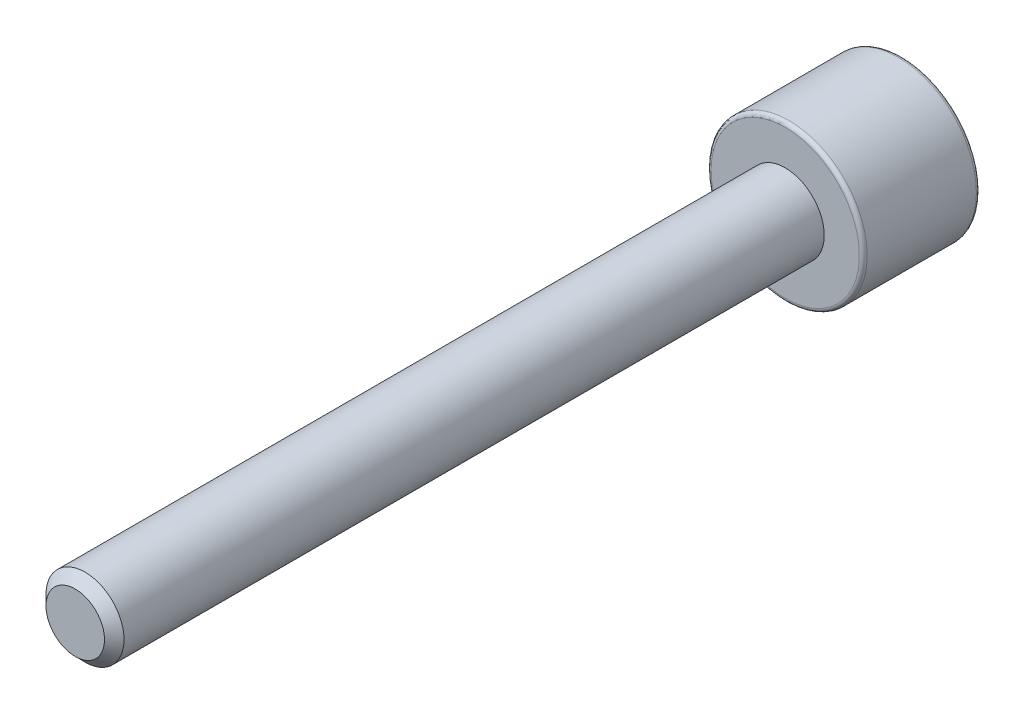
ISO-10303-21;
HEADER;
FILE_DESCRIPTION(('STEP AP214'),'2;1');
FILE_NAME('part.step','',(''),(''),'','','');
FILE_SCHEMA(('AUTOMOTIVE_DESIGN { 1 0 10303 214 1 1 1 1 }'));
ENDSEC;
DATA;
#1=APPLICATION_CONTEXT('core data for automotive mechanical design processes');
#2=APPLICATION_PROTOCOL_DEFINITION('international standard','automotive_design',2000,#1);
#3=PRODUCT_CONTEXT('',#1,'mechanical');
#4=PRODUCT('Part','Part','',(#3));
#5=PRODUCT_RELATED_PRODUCT_CATEGORY('part','',(#4));
#6=PRODUCT_DEFINITION_FORMATION('','',#4);
#7=PRODUCT_DEFINITION_CONTEXT('part definition',#1,'design');
#8=PRODUCT_DEFINITION('design','',#6,#7);
#9=PRODUCT_DEFINITION_SHAPE('','',#8);
#10=(LENGTH_UNIT() NAMED_UNIT(*) SI_UNIT(.MILLI.,.METRE.));
#11=(NAMED_UNIT(*) PLANE_ANGLE_UNIT() SI_UNIT($,.RADIAN.));
#12=(NAMED_UNIT(*) SI_UNIT($,.STERADIAN.) SOLID_ANGLE_UNIT());
#13=UNCERTAINTY_MEASURE_WITH_UNIT(LENGTH_MEASURE(1.E-05),#10,'distance_accuracy_value','');
#14=(GEOMETRIC_REPRESENTATION_CONTEXT(3) GLOBAL_UNCERTAINTY_ASSIGNED_CONTEXT((#13)) GLOBAL_UNIT_ASSIGNED_CONTEXT((#10,
#11,#12)) REPRESENTATION_CONTEXT('',''));
#15=CARTESIAN_POINT('',(0.,0.,0.));
#16=DIRECTION('',(0.,0.,1.));
#17=DIRECTION('',(1.,0.,0.));
#18=AXIS2_PLACEMENT_3D('',#15,#16,#17);
#19=CARTESIAN_POINT('',(0.,4.00000000000001,-6.));
#20=DIRECTION('',(0.,0.,1.));
#21=DIRECTION('',(1.,0.,0.));
#22=AXIS2_PLACEMENT_3D('',#19,#20,#21);
#23=PLANE('',#22);
#24=CARTESIAN_POINT('',(2.39807621135331,-1.38452994616208,-6.));
#25=DIRECTION('',(0.,0.,1.));
#26=DIRECTION('',(1.,0.,0.));
#27=AXIS2_PLACEMENT_3D('',#24,#25,#26);
#28=CIRCLE('',#27,0.4);
#29=CARTESIAN_POINT('',(2.79807621135332,-1.38452994616208,-6.));
#30=VERTEX_POINT('',#29);
#31=CARTESIAN_POINT('',(2.59807621135331,-1.73094010767585,-6.));
#32=VERTEX_POINT('',#31);
#33=EDGE_CURVE('E65',#30,#32,#28,.F.);
#34=ORIENTED_EDGE('',*,*,#33,.F.);
#35=DIRECTION('',(0.,-1.,0.));
#36=VECTOR('',#35,1.);
#37=CARTESIAN_POINT('',(2.79807621135332,1.5,-6.));
#38=LINE('',#37,#36);
#39=CARTESIAN_POINT('',(2.79807621135332,1.38452994616208,-6.));
#40=VERTEX_POINT('',#39);
#41=EDGE_CURVE('E11',#30,#40,#38,.F.);
#42=ORIENTED_EDGE('',*,*,#41,.T.);
#43=CARTESIAN_POINT('',(2.39807621135332,1.38452994616208,-6.));
#44=DIRECTION('',(0.,0.,1.));
#45=DIRECTION('',(1.,0.,0.));
#46=AXIS2_PLACEMENT_3D('',#43,#44,#45);
#47=CIRCLE('',#46,0.4);
#48=CARTESIAN_POINT('',(2.59807621135332,1.73094010767585,-6.));
#49=VERTEX_POINT('',#48);
#50=EDGE_CURVE('E55',#49,#40,#47,.F.);
#51=ORIENTED_EDGE('',*,*,#50,.F.);
#52=DIRECTION('',(0.866025403784439,-0.5,0.));
#53=VECTOR('',#52,1.);
#54=CARTESIAN_POINT('',(0.1,3.17320508075689,-6.));
#55=LINE('',#54,#53);
#56=CARTESIAN_POINT('',(0.2,3.11547005383793,-6.));
#57=VERTEX_POINT('',#56);
#58=EDGE_CURVE('E307',#49,#57,#55,.F.);
#59=ORIENTED_EDGE('',*,*,#58,.T.);
#60=CARTESIAN_POINT('',(0.,2.76905989232415,-6.));
#61=DIRECTION('',(0.,0.,1.));
#62=DIRECTION('',(1.,0.,0.));
#63=AXIS2_PLACEMENT_3D('',#60,#61,#62);
#64=CIRCLE('',#63,0.4);
#65=CARTESIAN_POINT('',(-0.2,3.11547005383792,-6.));
#66=VERTEX_POINT('',#65);
#67=EDGE_CURVE('E303',#66,#57,#64,.F.);
#68=ORIENTED_EDGE('',*,*,#67,.F.);
#69=DIRECTION('',(0.866025403784439,0.5,0.));
#70=VECTOR('',#69,1.);
#71=CARTESIAN_POINT('',(-2.69807621135332,1.67320508075689,-6.));
#72=LINE('',#71,#70);
#73=CARTESIAN_POINT('',(-2.59807621135332,1.73094010767585,-6.));
#74=VERTEX_POINT('',#73);
#75=EDGE_CURVE('E302',#66,#74,#72,.F.);
#76=ORIENTED_EDGE('',*,*,#75,.T.);
#77=CARTESIAN_POINT('',(-2.39807621135332,1.38452994616208,-6.));
#78=DIRECTION('',(0.,0.,1.));
#79=DIRECTION('',(1.,0.,0.));
#80=AXIS2_PLACEMENT_3D('',#77,#78,#79);
#81=CIRCLE('',#80,0.4);
#82=CARTESIAN_POINT('',(-2.79807621135332,1.38452994616208,-6.));
#83=VERTEX_POINT('',#82);
#84=EDGE_CURVE('E214',#83,#74,#81,.F.);
#85=ORIENTED_EDGE('',*,*,#84,.F.);
#86=DIRECTION('',(0.,1.,0.));
#87=VECTOR('',#86,1.);
#88=CARTESIAN_POINT('',(-2.79807621135332,-1.5,-6.));
#89=LINE('',#88,#87);
#90=CARTESIAN_POINT('',(-2.79807621135332,-1.38452994616207,-6.));
#91=VERTEX_POINT('',#90);
#92=EDGE_CURVE('E300',#83,#91,#89,.F.);
#93=ORIENTED_EDGE('',*,*,#92,.T.);
#94=CARTESIAN_POINT('',(-2.39807621135332,-1.38452994616207,-6.));
#95=DIRECTION('',(0.,0.,1.));
#96=DIRECTION('',(1.,0.,0.));
#97=AXIS2_PLACEMENT_3D('',#94,#95,#96);
#98=CIRCLE('',#97,0.4);
#99=CARTESIAN_POINT('',(-2.59807621135332,-1.73094010767585,-6.));
#100=VERTEX_POINT('',#99);
#101=EDGE_CURVE('E293',#100,#91,#98,.F.);
#102=ORIENTED_EDGE('',*,*,#101,.F.);
#103=DIRECTION('',(-0.866025403784439,0.5,0.));
#104=VECTOR('',#103,1.);
#105=CARTESIAN_POINT('',(-0.0999999999999995,-3.17320508075689,-6.));
#106=LINE('',#105,#104);
#107=CARTESIAN_POINT('',(-0.2,-3.11547005383792,-6.));
#108=VERTEX_POINT('',#107);
#109=EDGE_CURVE('E291',#100,#108,#106,.F.);
#110=ORIENTED_EDGE('',*,*,#109,.T.);
#111=CARTESIAN_POINT('',(0.,-2.76905989232415,-6.));
#112=DIRECTION('',(0.,0.,1.));
#113=DIRECTION('',(1.,0.,0.));
#114=AXIS2_PLACEMENT_3D('',#111,#112,#113);
#115=CIRCLE('',#114,0.4);
#116=CARTESIAN_POINT('',(0.2,-3.11547005383792,-6.));
#117=VERTEX_POINT('',#116);
#118=EDGE_CURVE('E288',#117,#108,#115,.F.);
#119=ORIENTED_EDGE('',*,*,#118,.F.);
#120=DIRECTION('',(-0.866025403784439,-0.5,0.));
#121=VECTOR('',#120,1.);
#122=CARTESIAN_POINT('',(2.69807621135332,-1.67320508075689,-6.));
#123=LINE('',#122,#121);
#124=EDGE_CURVE('E305',#117,#32,#123,.F.);
#125=ORIENTED_EDGE('',*,*,#124,.T.);
#126=EDGE_LOOP('',(#34,#42,#51,#59,#68,#76,#85,#93,#102,#110,#119,#125));
#127=FACE_BOUND('',#126,.T.);
#128=CARTESIAN_POINT('',(0.,0.,-6.));
#129=DIRECTION('',(0.,0.,1.));
#130=DIRECTION('',(1.,0.,0.));
#131=AXIS2_PLACEMENT_3D('',#128,#129,#130);
#132=CIRCLE('',#131,3.8);
#133=CARTESIAN_POINT('',(3.8,0.,-6.));
#134=VERTEX_POINT('',#133);
#135=EDGE_CURVE('E230',#134,#134,#132,.F.);
#136=ORIENTED_EDGE('',*,*,#135,.T.);
#137=EDGE_LOOP('',(#136));
#138=FACE_BOUND('',#137,.T.);
#139=ADVANCED_FACE('F43',(#127,#138),#23,.F.);
#140=CARTESIAN_POINT('',(0.,0.,36.4));
#141=DIRECTION('',(0.,0.,-1.));
#142=DIRECTION('',(-1.,0.,0.));
#143=AXIS2_PLACEMENT_3D('',#140,#141,#142);
#144=PLANE('',#143);
#145=CARTESIAN_POINT('',(0.,0.,36.4));
#146=DIRECTION('',(0.,0.,-1.));
#147=DIRECTION('',(-1.,0.,0.));
#148=AXIS2_PLACEMENT_3D('',#145,#146,#147);
#149=CIRCLE('',#148,1.49999999999999);
#150=CARTESIAN_POINT('',(-1.49999999999999,0.,36.4));
#151=VERTEX_POINT('',#150);
#152=EDGE_CURVE('E409',#151,#151,#149,.F.);
#153=ORIENTED_EDGE('',*,*,#152,.T.);
#154=EDGE_LOOP('',(#153));
#155=FACE_BOUND('',#154,.T.);
#156=ADVANCED_FACE('F451',(#155),#144,.F.);
#157=CARTESIAN_POINT('',(0.,0.,38.5484021491711));
#158=DIRECTION('',(0.,0.,1.));
#159=DIRECTION('',(1.,0.,0.));
#160=AXIS2_PLACEMENT_3D('',#157,#158,#159);
#161=CYLINDRICAL_SURFACE('',#160,2.);
#162=CARTESIAN_POINT('',(0.,0.,35.9));
#163=DIRECTION('',(0.,0.,-1.));
#164=DIRECTION('',(-1.,0.,0.));
#165=AXIS2_PLACEMENT_3D('',#162,#163,#164);
#166=CIRCLE('',#165,2.);
#167=CARTESIAN_POINT('',(-2.,0.,35.9));
#168=VERTEX_POINT('',#167);
#169=EDGE_CURVE('E414',#168,#168,#166,.T.);
#170=ORIENTED_EDGE('',*,*,#169,.T.);
#171=EDGE_LOOP('',(#170));
#172=FACE_BOUND('',#171,.T.);
#173=CARTESIAN_POINT('',(0.,0.,0.));
#174=DIRECTION('',(0.,0.,1.));
#175=DIRECTION('',(1.,0.,0.));
#176=AXIS2_PLACEMENT_3D('',#173,#174,#175);
#177=CIRCLE('',#176,2.);
#178=CARTESIAN_POINT('',(2.,0.,0.));
#179=VERTEX_POINT('',#178);
#180=EDGE_CURVE('E402',#179,#179,#177,.T.);
#181=ORIENTED_EDGE('',*,*,#180,.T.);
#182=EDGE_LOOP('',(#181));
#183=FACE_BOUND('',#182,.T.);
#184=ADVANCED_FACE('F450',(#172,#183),#161,.T.);
#185=CARTESIAN_POINT('',(0.,2.,0.));
#186=DIRECTION('',(0.,0.,-1.));
#187=DIRECTION('',(-1.,0.,0.));
#188=AXIS2_PLACEMENT_3D('',#185,#186,#187);
#189=PLANE('',#188);
#190=CARTESIAN_POINT('',(0.,0.,0.));
#191=DIRECTION('',(0.,0.,-1.));
#192=DIRECTION('',(-1.,0.,0.));
#193=AXIS2_PLACEMENT_3D('',#190,#191,#192);
#194=CIRCLE('',#193,3.8);
#195=CARTESIAN_POINT('',(-3.8,0.,0.));
#196=VERTEX_POINT('',#195);
#197=EDGE_CURVE('E223',#196,#196,#194,.F.);
#198=ORIENTED_EDGE('',*,*,#197,.T.);
#199=EDGE_LOOP('',(#198));
#200=FACE_BOUND('',#199,.T.);
#201=ORIENTED_EDGE('',*,*,#180,.F.);
#202=EDGE_LOOP('',(#201));
#203=FACE_BOUND('',#202,.T.);
#204=ADVANCED_FACE('F440',(#200,#203),#189,.F.);
#205=CARTESIAN_POINT('',(0.,0.,38.5484021491711));
#206=DIRECTION('',(0.,0.,1.));
#207=DIRECTION('',(1.,0.,0.));
#208=AXIS2_PLACEMENT_3D('',#205,#206,#207);
#209=CYLINDRICAL_SURFACE('',#208,4.);
#210=CARTESIAN_POINT('',(0.,0.,-5.8));
#211=DIRECTION('',(0.,0.,1.));
#212=DIRECTION('',(1.,0.,0.));
#213=AXIS2_PLACEMENT_3D('',#210,#211,#212);
#214=CIRCLE('',#213,4.);
#215=CARTESIAN_POINT('',(4.,0.,-5.8));
#216=VERTEX_POINT('',#215);
#217=EDGE_CURVE('E419',#216,#216,#214,.T.);
#218=ORIENTED_EDGE('',*,*,#217,.T.);
#219=EDGE_LOOP('',(#218));
#220=FACE_BOUND('',#219,.T.);
#221=CARTESIAN_POINT('',(0.,0.,-0.199999999999999));
#222=DIRECTION('',(0.,0.,-1.));
#223=DIRECTION('',(-1.,0.,0.));
#224=AXIS2_PLACEMENT_3D('',#221,#222,#223);
#225=CIRCLE('',#224,4.);
#226=CARTESIAN_POINT('',(-4.,0.,-0.199999999999999));
#227=VERTEX_POINT('',#226);
#228=EDGE_CURVE('E417',#227,#227,#225,.T.);
#229=ORIENTED_EDGE('',*,*,#228,.T.);
#230=EDGE_LOOP('',(#229));
#231=FACE_BOUND('',#230,.T.);
#232=ADVANCED_FACE('F432',(#220,#231),#209,.T.);
#233=CARTESIAN_POINT('',(0.,0.,36.4));
#234=DIRECTION('',(0.,0.,-1.));
#235=DIRECTION('',(-1.,0.,0.));
#236=AXIS2_PLACEMENT_3D('',#233,#234,#235);
#237=CONICAL_SURFACE('',#236,1.49999999999999,0.785398163397449);
#238=ORIENTED_EDGE('',*,*,#169,.F.);
#239=EDGE_LOOP('',(#238));
#240=FACE_BOUND('',#239,.T.);
#241=ORIENTED_EDGE('',*,*,#152,.F.);
#242=EDGE_LOOP('',(#241));
#243=FACE_BOUND('',#242,.T.);
#244=ADVANCED_FACE('F429',(#240,#243),#237,.T.);
#245=CARTESIAN_POINT('',(0.,0.,-5.8));
#246=DIRECTION('',(0.,0.,1.));
#247=DIRECTION('',(1.,0.,0.));
#248=AXIS2_PLACEMENT_3D('',#245,#246,#247);
#249=TOROIDAL_SURFACE('',#248,3.8,0.2);
#250=ORIENTED_EDGE('',*,*,#135,.F.);
#251=EDGE_LOOP('',(#250));
#252=FACE_BOUND('',#251,.T.);
#253=ORIENTED_EDGE('',*,*,#217,.F.);
#254=EDGE_LOOP('',(#253));
#255=FACE_BOUND('',#254,.T.);
#256=ADVANCED_FACE('F426',(#252,#255),#249,.T.);
#257=CARTESIAN_POINT('',(0.,0.,-0.199999999999999));
#258=DIRECTION('',(0.,0.,-1.));
#259=DIRECTION('',(-1.,0.,0.));
#260=AXIS2_PLACEMENT_3D('',#257,#258,#259);
#261=TOROIDAL_SURFACE('',#260,3.8,0.2);
#262=ORIENTED_EDGE('',*,*,#228,.F.);
#263=EDGE_LOOP('',(#262));
#264=FACE_BOUND('',#263,.T.);
#265=ORIENTED_EDGE('',*,*,#197,.F.);
#266=EDGE_LOOP('',(#265));
#267=FACE_BOUND('',#266,.T.);
#268=ADVANCED_FACE('F427',(#264,#267),#261,.T.);
#269=CARTESIAN_POINT('',(-2.59807621135332,1.5,-6.000012));
#270=DIRECTION('',(0.5,-0.866025403784439,0.));
#271=DIRECTION('',(0.866025403784439,0.5,0.));
#272=AXIS2_PLACEMENT_3D('',#269,#270,#271);
#273=PLANE('',#272);
#274=DIRECTION('',(0.,0.,1.));
#275=VECTOR('',#274,1.);
#276=CARTESIAN_POINT('',(-0.1,2.94226497308104,-1.));
#277=LINE('',#276,#275);
#278=CARTESIAN_POINT('',(-0.1,2.94226497308104,-5.8));
#279=VERTEX_POINT('',#278);
#280=CARTESIAN_POINT('',(-0.1,2.94226497308104,-1.2));
#281=VERTEX_POINT('',#280);
#282=EDGE_CURVE('E198',#279,#281,#277,.T.);
#283=ORIENTED_EDGE('',*,*,#282,.T.);
#284=DIRECTION('',(0.866025403784439,0.5,0.));
#285=VECTOR('',#284,1.);
#286=CARTESIAN_POINT('',(-2.59807621135332,1.5,-1.2));
#287=LINE('',#286,#285);
#288=CARTESIAN_POINT('',(-2.49807621135332,1.55773502691896,-1.2));
#289=VERTEX_POINT('',#288);
#290=EDGE_CURVE('E194',#281,#289,#287,.F.);
#291=ORIENTED_EDGE('',*,*,#290,.T.);
#292=DIRECTION('',(0.,0.,1.));
#293=VECTOR('',#292,1.);
#294=CARTESIAN_POINT('',(-2.49807621135332,1.55773502691896,-6.));
#295=LINE('',#294,#293);
#296=CARTESIAN_POINT('',(-2.49807621135332,1.55773502691896,-5.8));
#297=VERTEX_POINT('',#296);
#298=EDGE_CURVE('E184',#289,#297,#295,.F.);
#299=ORIENTED_EDGE('',*,*,#298,.T.);
#300=DIRECTION('',(0.866025403784439,0.5,0.));
#301=VECTOR('',#300,1.);
#302=CARTESIAN_POINT('',(0.,3.,-5.8));
#303=LINE('',#302,#301);
#304=EDGE_CURVE('E186',#297,#279,#303,.T.);
#305=ORIENTED_EDGE('',*,*,#304,.T.);
#306=EDGE_LOOP('',(#283,#291,#299,#305));
#307=FACE_BOUND('',#306,.T.);
#308=ADVANCED_FACE('F189',(#307),#273,.T.);
#309=CARTESIAN_POINT('',(0.,3.,-6.000012));
#310=DIRECTION('',(-0.5,-0.866025403784439,0.));
#311=DIRECTION('',(0.866025403784439,-0.5,0.));
#312=AXIS2_PLACEMENT_3D('',#309,#310,#311);
#313=PLANE('',#312);
#314=DIRECTION('',(0.,0.,1.));
#315=VECTOR('',#314,1.);
#316=CARTESIAN_POINT('',(2.49807621135332,1.55773502691896,-1.));
#317=LINE('',#316,#315);
#318=CARTESIAN_POINT('',(2.49807621135332,1.55773502691896,-5.8));
#319=VERTEX_POINT('',#318);
#320=CARTESIAN_POINT('',(2.49807621135332,1.55773502691896,-1.2));
#321=VERTEX_POINT('',#320);
#322=EDGE_CURVE('E237',#319,#321,#317,.T.);
#323=ORIENTED_EDGE('',*,*,#322,.T.);
#324=DIRECTION('',(0.866025403784439,-0.5,0.));
#325=VECTOR('',#324,1.);
#326=CARTESIAN_POINT('',(0.,3.,-1.2));
#327=LINE('',#326,#325);
#328=CARTESIAN_POINT('',(0.0999999999999998,2.94226497308104,-1.2));
#329=VERTEX_POINT('',#328);
#330=EDGE_CURVE('E242',#321,#329,#327,.F.);
#331=ORIENTED_EDGE('',*,*,#330,.T.);
#332=DIRECTION('',(0.,0.,1.));
#333=VECTOR('',#332,1.);
#334=CARTESIAN_POINT('',(0.0999999999999998,2.94226497308104,-6.));
#335=LINE('',#334,#333);
#336=CARTESIAN_POINT('',(0.0999999999999998,2.94226497308104,-5.8));
#337=VERTEX_POINT('',#336);
#338=EDGE_CURVE('E236',#329,#337,#335,.F.);
#339=ORIENTED_EDGE('',*,*,#338,.T.);
#340=DIRECTION('',(0.866025403784439,-0.5,0.));
#341=VECTOR('',#340,1.);
#342=CARTESIAN_POINT('',(2.59807621135332,1.5,-5.8));
#343=LINE('',#342,#341);
#344=EDGE_CURVE('E231',#337,#319,#343,.T.);
#345=ORIENTED_EDGE('',*,*,#344,.T.);
#346=EDGE_LOOP('',(#323,#331,#339,#345));
#347=FACE_BOUND('',#346,.T.);
#348=ADVANCED_FACE('F469',(#347),#313,.T.);
#349=CARTESIAN_POINT('',(2.59807621135332,1.5,-6.000012));
#350=DIRECTION('',(-1.,0.,0.));
#351=DIRECTION('',(0.,-1.,0.));
#352=AXIS2_PLACEMENT_3D('',#349,#350,#351);
#353=PLANE('',#352);
#354=DIRECTION('',(0.,0.,1.));
#355=VECTOR('',#354,1.);
#356=CARTESIAN_POINT('',(2.59807621135332,-1.38452994616208,-1.));
#357=LINE('',#356,#355);
#358=CARTESIAN_POINT('',(2.59807621135332,-1.38452994616208,-5.8));
#359=VERTEX_POINT('',#358);
#360=CARTESIAN_POINT('',(2.59807621135332,-1.38452994616208,-1.2));
#361=VERTEX_POINT('',#360);
#362=EDGE_CURVE('E243',#359,#361,#357,.T.);
#363=ORIENTED_EDGE('',*,*,#362,.T.);
#364=DIRECTION('',(0.,-1.,0.));
#365=VECTOR('',#364,1.);
#366=CARTESIAN_POINT('',(2.59807621135332,1.5,-1.2));
#367=LINE('',#366,#365);
#368=CARTESIAN_POINT('',(2.59807621135332,1.38452994616208,-1.2));
#369=VERTEX_POINT('',#368);
#370=EDGE_CURVE('E248',#361,#369,#367,.F.);
#371=ORIENTED_EDGE('',*,*,#370,.T.);
#372=DIRECTION('',(0.,0.,1.));
#373=VECTOR('',#372,1.);
#374=CARTESIAN_POINT('',(2.59807621135332,1.38452994616208,-6.));
#375=LINE('',#374,#373);
#376=CARTESIAN_POINT('',(2.59807621135332,1.38452994616208,-5.8));
#377=VERTEX_POINT('',#376);
#378=EDGE_CURVE('E249',#369,#377,#375,.F.);
#379=ORIENTED_EDGE('',*,*,#378,.T.);
#380=DIRECTION('',(0.,-1.,0.));
#381=VECTOR('',#380,1.);
#382=CARTESIAN_POINT('',(2.59807621135332,-1.5,-5.8));
#383=LINE('',#382,#381);
#384=EDGE_CURVE('E245',#377,#359,#383,.T.);
#385=ORIENTED_EDGE('',*,*,#384,.T.);
#386=EDGE_LOOP('',(#363,#371,#379,#385));
#387=FACE_BOUND('',#386,.T.);
#388=ADVANCED_FACE('F468',(#387),#353,.T.);
#389=CARTESIAN_POINT('',(2.59807621135332,-1.5,-6.000012));
#390=DIRECTION('',(-0.5,0.866025403784439,0.));
#391=DIRECTION('',(-0.866025403784439,-0.5,0.));
#392=AXIS2_PLACEMENT_3D('',#389,#390,#391);
#393=PLANE('',#392);
#394=DIRECTION('',(0.,0.,1.));
#395=VECTOR('',#394,1.);
#396=CARTESIAN_POINT('',(0.0999999999999998,-2.94226497308104,-1.));
#397=LINE('',#396,#395);
#398=CARTESIAN_POINT('',(0.0999999999999997,-2.94226497308104,-5.8));
#399=VERTEX_POINT('',#398);
#400=CARTESIAN_POINT('',(0.0999999999999997,-2.94226497308104,-1.2));
#401=VERTEX_POINT('',#400);
#402=EDGE_CURVE('E255',#399,#401,#397,.T.);
#403=ORIENTED_EDGE('',*,*,#402,.T.);
#404=DIRECTION('',(-0.866025403784439,-0.5,0.));
#405=VECTOR('',#404,1.);
#406=CARTESIAN_POINT('',(2.59807621135332,-1.5,-1.2));
#407=LINE('',#406,#405);
#408=CARTESIAN_POINT('',(2.49807621135331,-1.55773502691896,-1.2));
#409=VERTEX_POINT('',#408);
#410=EDGE_CURVE('E259',#401,#409,#407,.F.);
#411=ORIENTED_EDGE('',*,*,#410,.T.);
#412=DIRECTION('',(0.,0.,1.));
#413=VECTOR('',#412,1.);
#414=CARTESIAN_POINT('',(2.49807621135331,-1.55773502691896,-6.));
#415=LINE('',#414,#413);
#416=CARTESIAN_POINT('',(2.49807621135331,-1.55773502691896,-5.8));
#417=VERTEX_POINT('',#416);
#418=EDGE_CURVE('E258',#409,#417,#415,.F.);
#419=ORIENTED_EDGE('',*,*,#418,.T.);
#420=DIRECTION('',(-0.866025403784439,-0.5,0.));
#421=VECTOR('',#420,1.);
#422=CARTESIAN_POINT('',(0.,-3.,-5.8));
#423=LINE('',#422,#421);
#424=EDGE_CURVE('E252',#417,#399,#423,.T.);
#425=ORIENTED_EDGE('',*,*,#424,.T.);
#426=EDGE_LOOP('',(#403,#411,#419,#425));
#427=FACE_BOUND('',#426,.T.);
#428=ADVANCED_FACE('F475',(#427),#393,.T.);
#429=CARTESIAN_POINT('',(0.,-3.,-6.000012));
#430=DIRECTION('',(0.5,0.866025403784439,0.));
#431=DIRECTION('',(-0.866025403784439,0.5,0.));
#432=AXIS2_PLACEMENT_3D('',#429,#430,#431);
#433=PLANE('',#432);
#434=DIRECTION('',(0.,0.,1.));
#435=VECTOR('',#434,1.);
#436=CARTESIAN_POINT('',(-2.49807621135332,-1.55773502691896,-1.));
#437=LINE('',#436,#435);
#438=CARTESIAN_POINT('',(-2.49807621135332,-1.55773502691896,-5.8));
#439=VERTEX_POINT('',#438);
#440=CARTESIAN_POINT('',(-2.49807621135332,-1.55773502691896,-1.2));
#441=VERTEX_POINT('',#440);
#442=EDGE_CURVE('E269',#439,#441,#437,.T.);
#443=ORIENTED_EDGE('',*,*,#442,.T.);
#444=DIRECTION('',(-0.866025403784439,0.5,0.));
#445=VECTOR('',#444,1.);
#446=CARTESIAN_POINT('',(0.,-3.,-1.2));
#447=LINE('',#446,#445);
#448=CARTESIAN_POINT('',(-0.1,-2.94226497308104,-1.2));
#449=VERTEX_POINT('',#448);
#450=EDGE_CURVE('E274',#441,#449,#447,.F.);
#451=ORIENTED_EDGE('',*,*,#450,.T.);
#452=DIRECTION('',(0.,0.,1.));
#453=VECTOR('',#452,1.);
#454=CARTESIAN_POINT('',(-0.1,-2.94226497308104,-6.));
#455=LINE('',#454,#453);
#456=CARTESIAN_POINT('',(-0.1,-2.94226497308104,-5.8));
#457=VERTEX_POINT('',#456);
#458=EDGE_CURVE('E275',#449,#457,#455,.F.);
#459=ORIENTED_EDGE('',*,*,#458,.T.);
#460=DIRECTION('',(-0.866025403784439,0.5,0.));
#461=VECTOR('',#460,1.);
#462=CARTESIAN_POINT('',(-2.59807621135332,-1.5,-5.8));
#463=LINE('',#462,#461);
#464=EDGE_CURVE('E268',#457,#439,#463,.T.);
#465=ORIENTED_EDGE('',*,*,#464,.T.);
#466=EDGE_LOOP('',(#443,#451,#459,#465));
#467=FACE_BOUND('',#466,.T.);
#468=ADVANCED_FACE('F476',(#467),#433,.T.);
#469=CARTESIAN_POINT('',(-2.59807621135332,-1.5,-6.000012));
#470=DIRECTION('',(1.,0.,0.));
#471=DIRECTION('',(0.,1.,0.));
#472=AXIS2_PLACEMENT_3D('',#469,#470,#471);
#473=PLANE('',#472);
#474=DIRECTION('',(0.,0.,1.));
#475=VECTOR('',#474,1.);
#476=CARTESIAN_POINT('',(-2.59807621135332,1.38452994616208,-1.));
#477=LINE('',#476,#475);
#478=CARTESIAN_POINT('',(-2.59807621135332,1.38452994616208,-5.8));
#479=VERTEX_POINT('',#478);
#480=CARTESIAN_POINT('',(-2.59807621135332,1.38452994616208,-1.2));
#481=VERTEX_POINT('',#480);
#482=EDGE_CURVE('E204',#479,#481,#477,.T.);
#483=ORIENTED_EDGE('',*,*,#482,.T.);
#484=DIRECTION('',(0.,1.,0.));
#485=VECTOR('',#484,1.);
#486=CARTESIAN_POINT('',(-2.59807621135332,-1.5,-1.2));
#487=LINE('',#486,#485);
#488=CARTESIAN_POINT('',(-2.59807621135332,-1.38452994616207,-1.2));
#489=VERTEX_POINT('',#488);
#490=EDGE_CURVE('E266',#481,#489,#487,.F.);
#491=ORIENTED_EDGE('',*,*,#490,.T.);
#492=DIRECTION('',(0.,0.,1.));
#493=VECTOR('',#492,1.);
#494=CARTESIAN_POINT('',(-2.59807621135332,-1.38452994616207,-6.));
#495=LINE('',#494,#493);
#496=CARTESIAN_POINT('',(-2.59807621135332,-1.38452994616207,-5.8));
#497=VERTEX_POINT('',#496);
#498=EDGE_CURVE('E263',#489,#497,#495,.F.);
#499=ORIENTED_EDGE('',*,*,#498,.T.);
#500=DIRECTION('',(0.,1.,0.));
#501=VECTOR('',#500,1.);
#502=CARTESIAN_POINT('',(-2.59807621135332,1.5,-5.8));
#503=LINE('',#502,#501);
#504=EDGE_CURVE('E261',#497,#479,#503,.T.);
#505=ORIENTED_EDGE('',*,*,#504,.T.);
#506=EDGE_LOOP('',(#483,#491,#499,#505));
#507=FACE_BOUND('',#506,.T.);
#508=ADVANCED_FACE('F485',(#507),#473,.T.);
#509=CARTESIAN_POINT('',(0.,0.,-1.));
#510=DIRECTION('',(0.,0.,-1.));
#511=DIRECTION('',(-1.,0.,0.));
#512=AXIS2_PLACEMENT_3D('',#509,#510,#511);
#513=PLANE('',#512);
#514=DIRECTION('',(0.866025403784439,0.5,0.));
#515=VECTOR('',#514,1.);
#516=CARTESIAN_POINT('',(0.1,2.82679491924311,-1.));
#517=LINE('',#516,#515);
#518=CARTESIAN_POINT('',(-2.39807621135332,1.38452994616208,-1.));
#519=VERTEX_POINT('',#518);
#520=CARTESIAN_POINT('',(0.,2.76905989232415,-1.));
#521=VERTEX_POINT('',#520);
#522=EDGE_CURVE('E276',#519,#521,#517,.T.);
#523=ORIENTED_EDGE('',*,*,#522,.T.);
#524=DIRECTION('',(0.866025403784439,-0.5,0.));
#525=VECTOR('',#524,1.);
#526=CARTESIAN_POINT('',(2.49807621135332,1.32679491924311,-1.));
#527=LINE('',#526,#525);
#528=CARTESIAN_POINT('',(2.39807621135332,1.38452994616208,-1.));
#529=VERTEX_POINT('',#528);
#530=EDGE_CURVE('E289',#521,#529,#527,.T.);
#531=ORIENTED_EDGE('',*,*,#530,.T.);
#532=DIRECTION('',(0.,-1.,0.));
#533=VECTOR('',#532,1.);
#534=CARTESIAN_POINT('',(2.39807621135331,-1.5,-1.));
#535=LINE('',#534,#533);
#536=CARTESIAN_POINT('',(2.39807621135331,-1.38452994616208,-1.));
#537=VERTEX_POINT('',#536);
#538=EDGE_CURVE('E283',#529,#537,#535,.T.);
#539=ORIENTED_EDGE('',*,*,#538,.T.);
#540=DIRECTION('',(-0.866025403784439,-0.5,0.));
#541=VECTOR('',#540,1.);
#542=CARTESIAN_POINT('',(-0.100000000000001,-2.82679491924311,-1.));
#543=LINE('',#542,#541);
#544=CARTESIAN_POINT('',(0.,-2.76905989232415,-1.));
#545=VERTEX_POINT('',#544);
#546=EDGE_CURVE('E285',#537,#545,#543,.T.);
#547=ORIENTED_EDGE('',*,*,#546,.T.);
#548=DIRECTION('',(-0.866025403784439,0.5,0.));
#549=VECTOR('',#548,1.);
#550=CARTESIAN_POINT('',(-2.49807621135332,-1.32679491924311,-1.));
#551=LINE('',#550,#549);
#552=CARTESIAN_POINT('',(-2.39807621135332,-1.38452994616207,-1.));
#553=VERTEX_POINT('',#552);
#554=EDGE_CURVE('E282',#545,#553,#551,.T.);
#555=ORIENTED_EDGE('',*,*,#554,.T.);
#556=DIRECTION('',(0.,1.,0.));
#557=VECTOR('',#556,1.);
#558=CARTESIAN_POINT('',(-2.39807621135332,1.5,-1.));
#559=LINE('',#558,#557);
#560=EDGE_CURVE('E280',#553,#519,#559,.T.);
#561=ORIENTED_EDGE('',*,*,#560,.T.);
#562=EDGE_LOOP('',(#523,#531,#539,#547,#555,#561));
#563=FACE_BOUND('',#562,.T.);
#564=ADVANCED_FACE('F486',(#563),#513,.T.);
#565=CARTESIAN_POINT('',(0.,-2.76905989232415,-6.000012));
#566=DIRECTION('',(0.,0.,-1.));
#567=DIRECTION('',(-1.,0.,0.));
#568=AXIS2_PLACEMENT_3D('',#565,#566,#567);
#569=CYLINDRICAL_SURFACE('',#568,0.2);
#570=CARTESIAN_POINT('',(0.,-2.76905989232415,-5.8));
#571=DIRECTION('',(0.,0.,1.));
#572=DIRECTION('',(1.,0.,0.));
#573=AXIS2_PLACEMENT_3D('',#570,#571,#572);
#574=CIRCLE('',#573,0.2);
#575=EDGE_CURVE('E50',#457,#399,#574,.T.);
#576=ORIENTED_EDGE('',*,*,#575,.F.);
#577=ORIENTED_EDGE('',*,*,#458,.F.);
#578=CARTESIAN_POINT('',(0.,-2.76905989232415,-1.2));
#579=DIRECTION('',(0.,0.,-1.));
#580=DIRECTION('',(-1.,0.,0.));
#581=AXIS2_PLACEMENT_3D('',#578,#579,#580);
#582=CIRCLE('',#581,0.2);
#583=EDGE_CURVE('E391',#401,#449,#582,.T.);
#584=ORIENTED_EDGE('',*,*,#583,.F.);
#585=ORIENTED_EDGE('',*,*,#402,.F.);
#586=EDGE_LOOP('',(#576,#577,#584,#585));
#587=FACE_BOUND('',#586,.T.);
#588=ADVANCED_FACE('F44',(#587),#569,.F.);
#589=CARTESIAN_POINT('',(0.,-2.76905989232415,-5.8));
#590=DIRECTION('',(0.,0.,1.));
#591=DIRECTION('',(1.,0.,0.));
#592=AXIS2_PLACEMENT_3D('',#589,#590,#591);
#593=TOROIDAL_SURFACE('',#592,0.4,0.2);
#594=CARTESIAN_POINT('',(-0.2,-3.11547005383792,-5.8));
#595=DIRECTION('',(0.866025403784439,-0.5,0.));
#596=DIRECTION('',(0.5,0.866025403784439,0.));
#597=AXIS2_PLACEMENT_3D('',#594,#595,#596);
#598=CIRCLE('',#597,0.2);
#599=EDGE_CURVE('E386',#457,#108,#598,.F.);
#600=ORIENTED_EDGE('',*,*,#599,.F.);
#601=ORIENTED_EDGE('',*,*,#575,.T.);
#602=CARTESIAN_POINT('',(0.2,-3.11547005383792,-5.8));
#603=DIRECTION('',(-0.866025403784439,-0.5,0.));
#604=DIRECTION('',(0.5,-0.866025403784439,0.));
#605=AXIS2_PLACEMENT_3D('',#602,#603,#604);
#606=CIRCLE('',#605,0.2);
#607=EDGE_CURVE('E394',#117,#399,#606,.F.);
#608=ORIENTED_EDGE('',*,*,#607,.F.);
#609=ORIENTED_EDGE('',*,*,#118,.T.);
#610=EDGE_LOOP('',(#600,#601,#608,#609));
#611=FACE_BOUND('',#610,.T.);
#612=ADVANCED_FACE('F492',(#611),#593,.T.);
#613=CARTESIAN_POINT('',(0.,-2.76905989232415,-1.2));
#614=DIRECTION('',(0.,0.,1.));
#615=DIRECTION('',(1.,0.,0.));
#616=AXIS2_PLACEMENT_3D('',#613,#614,#615);
#617=SPHERICAL_SURFACE('',#616,0.2);
#618=CARTESIAN_POINT('',(0.,-2.76905989232415,-1.2));
#619=DIRECTION('',(0.866025403784438,0.500000000000001,0.));
#620=DIRECTION('',(-0.500000000000001,0.866025403784438,0.));
#621=AXIS2_PLACEMENT_3D('',#618,#619,#620);
#622=CIRCLE('',#621,0.2);
#623=EDGE_CURVE('E382',#401,#545,#622,.F.);
#624=ORIENTED_EDGE('',*,*,#623,.F.);
#625=ORIENTED_EDGE('',*,*,#583,.T.);
#626=CARTESIAN_POINT('',(0.,-2.76905989232415,-1.2));
#627=DIRECTION('',(-0.866025403784439,0.5,0.));
#628=DIRECTION('',(-0.5,-0.866025403784439,0.));
#629=AXIS2_PLACEMENT_3D('',#626,#627,#628);
#630=CIRCLE('',#629,0.2);
#631=EDGE_CURVE('E387',#545,#449,#630,.F.);
#632=ORIENTED_EDGE('',*,*,#631,.F.);
#633=EDGE_LOOP('',(#624,#625,#632));
#634=FACE_BOUND('',#633,.T.);
#635=ADVANCED_FACE('F544',(#634),#617,.F.);
#636=CARTESIAN_POINT('',(2.69807621135331,-1.67320508075689,-5.8));
#637=DIRECTION('',(0.866025403784439,0.5,0.));
#638=DIRECTION('',(-0.5,0.866025403784439,0.));
#639=AXIS2_PLACEMENT_3D('',#636,#637,#638);
#640=CYLINDRICAL_SURFACE('',#639,0.2);
#641=ORIENTED_EDGE('',*,*,#607,.T.);
#642=ORIENTED_EDGE('',*,*,#424,.F.);
#643=CARTESIAN_POINT('',(2.59807621135331,-1.73094010767585,-5.8));
#644=DIRECTION('',(0.866025403784439,0.499999999999999,0.));
#645=DIRECTION('',(-0.499999999999999,0.866025403784439,0.));
#646=AXIS2_PLACEMENT_3D('',#643,#644,#645);
#647=CIRCLE('',#646,0.2);
#648=EDGE_CURVE('E378',#32,#417,#647,.T.);
#649=ORIENTED_EDGE('',*,*,#648,.F.);
#650=ORIENTED_EDGE('',*,*,#124,.F.);
#651=EDGE_LOOP('',(#641,#642,#649,#650));
#652=FACE_BOUND('',#651,.T.);
#653=ADVANCED_FACE('F619',(#652),#640,.T.);
#654=CARTESIAN_POINT('',(-0.1,-3.17320508075689,-5.8));
#655=DIRECTION('',(0.866025403784439,-0.5,0.));
#656=DIRECTION('',(0.5,0.866025403784439,0.));
#657=AXIS2_PLACEMENT_3D('',#654,#655,#656);
#658=CYLINDRICAL_SURFACE('',#657,0.2);
#659=ORIENTED_EDGE('',*,*,#599,.T.);
#660=ORIENTED_EDGE('',*,*,#109,.F.);
#661=CARTESIAN_POINT('',(-2.59807621135332,-1.73094010767585,-5.8));
#662=DIRECTION('',(-0.866025403784439,0.499999999999999,0.));
#663=DIRECTION('',(-0.499999999999999,-0.866025403784439,0.));
#664=AXIS2_PLACEMENT_3D('',#661,#662,#663);
#665=CIRCLE('',#664,0.2);
#666=EDGE_CURVE('E374',#439,#100,#665,.T.);
#667=ORIENTED_EDGE('',*,*,#666,.F.);
#668=ORIENTED_EDGE('',*,*,#464,.F.);
#669=EDGE_LOOP('',(#659,#660,#667,#668));
#670=FACE_BOUND('',#669,.T.);
#671=ADVANCED_FACE('F615',(#670),#658,.T.);
#672=CARTESIAN_POINT('',(-2.39807621135332,-1.38452994616207,-6.000012));
#673=DIRECTION('',(0.,0.,-1.));
#674=DIRECTION('',(-1.,0.,0.));
#675=AXIS2_PLACEMENT_3D('',#672,#673,#674);
#676=CYLINDRICAL_SURFACE('',#675,0.2);
#677=CARTESIAN_POINT('',(-2.39807621135332,-1.38452994616207,-1.2));
#678=DIRECTION('',(0.,0.,-1.));
#679=DIRECTION('',(-1.,0.,0.));
#680=AXIS2_PLACEMENT_3D('',#677,#678,#679);
#681=CIRCLE('',#680,0.2);
#682=EDGE_CURVE('E369',#441,#489,#681,.T.);
#683=ORIENTED_EDGE('',*,*,#682,.F.);
#684=ORIENTED_EDGE('',*,*,#442,.F.);
#685=CARTESIAN_POINT('',(-2.39807621135332,-1.38452994616207,-5.8));
#686=DIRECTION('',(0.,0.,1.));
#687=DIRECTION('',(1.,0.,0.));
#688=AXIS2_PLACEMENT_3D('',#685,#686,#687);
#689=CIRCLE('',#688,0.2);
#690=EDGE_CURVE('E375',#497,#439,#689,.T.);
#691=ORIENTED_EDGE('',*,*,#690,.F.);
#692=ORIENTED_EDGE('',*,*,#498,.F.);
#693=EDGE_LOOP('',(#683,#684,#691,#692));
#694=FACE_BOUND('',#693,.T.);
#695=ADVANCED_FACE('F608',(#694),#676,.F.);
#696=CARTESIAN_POINT('',(-1.19903810567666,-2.07679491924311,-1.2));
#697=DIRECTION('',(0.866025403784439,-0.5,0.));
#698=DIRECTION('',(0.5,0.866025403784439,0.));
#699=AXIS2_PLACEMENT_3D('',#696,#697,#698);
#700=CYLINDRICAL_SURFACE('',#699,0.2);
#701=ORIENTED_EDGE('',*,*,#631,.T.);
#702=ORIENTED_EDGE('',*,*,#450,.F.);
#703=CARTESIAN_POINT('',(-2.39807621135332,-1.38452994616207,-1.2));
#704=DIRECTION('',(0.866025403784441,-0.499999999999995,0.));
#705=DIRECTION('',(0.499999999999995,0.866025403784441,0.));
#706=AXIS2_PLACEMENT_3D('',#703,#704,#705);
#707=CIRCLE('',#706,0.2);
#708=EDGE_CURVE('E368',#553,#441,#707,.T.);
#709=ORIENTED_EDGE('',*,*,#708,.F.);
#710=ORIENTED_EDGE('',*,*,#554,.F.);
#711=EDGE_LOOP('',(#701,#702,#709,#710));
#712=FACE_BOUND('',#711,.T.);
#713=ADVANCED_FACE('F549',(#712),#700,.F.);
#714=CARTESIAN_POINT('',(1.19903810567666,-2.07679491924311,-1.2));
#715=DIRECTION('',(0.866025403784439,0.5,0.));
#716=DIRECTION('',(-0.5,0.866025403784439,0.));
#717=AXIS2_PLACEMENT_3D('',#714,#715,#716);
#718=CYLINDRICAL_SURFACE('',#717,0.2);
#719=ORIENTED_EDGE('',*,*,#623,.T.);
#720=ORIENTED_EDGE('',*,*,#546,.F.);
#721=CARTESIAN_POINT('',(2.39807621135331,-1.38452994616208,-1.2));
#722=DIRECTION('',(-0.866025403784439,-0.499999999999999,0.));
#723=DIRECTION('',(0.499999999999999,-0.866025403784439,0.));
#724=AXIS2_PLACEMENT_3D('',#721,#722,#723);
#725=CIRCLE('',#724,0.2);
#726=EDGE_CURVE('E361',#409,#537,#725,.T.);
#727=ORIENTED_EDGE('',*,*,#726,.F.);
#728=ORIENTED_EDGE('',*,*,#410,.F.);
#729=EDGE_LOOP('',(#719,#720,#727,#728));
#730=FACE_BOUND('',#729,.T.);
#731=ADVANCED_FACE('F535',(#730),#718,.F.);
#732=CARTESIAN_POINT('',(2.39807621135331,-1.38452994616208,-6.000012));
#733=DIRECTION('',(0.,0.,-1.));
#734=DIRECTION('',(-1.,0.,0.));
#735=AXIS2_PLACEMENT_3D('',#732,#733,#734);
#736=CYLINDRICAL_SURFACE('',#735,0.2);
#737=CARTESIAN_POINT('',(2.39807621135331,-1.38452994616208,-5.8));
#738=DIRECTION('',(0.,0.,1.));
#739=DIRECTION('',(1.,0.,0.));
#740=AXIS2_PLACEMENT_3D('',#737,#738,#739);
#741=CIRCLE('',#740,0.2);
#742=EDGE_CURVE('E379',#417,#359,#741,.T.);
#743=ORIENTED_EDGE('',*,*,#742,.F.);
#744=ORIENTED_EDGE('',*,*,#418,.F.);
#745=CARTESIAN_POINT('',(2.39807621135331,-1.38452994616208,-1.2));
#746=DIRECTION('',(0.,0.,-1.));
#747=DIRECTION('',(-1.,0.,0.));
#748=AXIS2_PLACEMENT_3D('',#745,#746,#747);
#749=CIRCLE('',#748,0.2);
#750=EDGE_CURVE('E358',#361,#409,#749,.T.);
#751=ORIENTED_EDGE('',*,*,#750,.F.);
#752=ORIENTED_EDGE('',*,*,#362,.F.);
#753=EDGE_LOOP('',(#743,#744,#751,#752));
#754=FACE_BOUND('',#753,.T.);
#755=ADVANCED_FACE('F541',(#754),#736,.F.);
#756=CARTESIAN_POINT('',(2.39807621135331,-1.38452994616208,-5.8));
#757=DIRECTION('',(0.,0.,1.));
#758=DIRECTION('',(1.,0.,0.));
#759=AXIS2_PLACEMENT_3D('',#756,#757,#758);
#760=TOROIDAL_SURFACE('',#759,0.4,0.2);
#761=ORIENTED_EDGE('',*,*,#648,.T.);
#762=ORIENTED_EDGE('',*,*,#742,.T.);
#763=CARTESIAN_POINT('',(2.79807621135332,-1.38452994616208,-5.8));
#764=DIRECTION('',(0.,-1.,0.));
#765=DIRECTION('',(0.,0.,-1.));
#766=AXIS2_PLACEMENT_3D('',#763,#764,#765);
#767=CIRCLE('',#766,0.2);
#768=EDGE_CURVE('E359',#30,#359,#767,.F.);
#769=ORIENTED_EDGE('',*,*,#768,.F.);
#770=ORIENTED_EDGE('',*,*,#33,.T.);
#771=EDGE_LOOP('',(#761,#762,#769,#770));
#772=FACE_BOUND('',#771,.T.);
#773=ADVANCED_FACE('F597',(#772),#760,.T.);
#774=CARTESIAN_POINT('',(-2.39807621135332,-1.38452994616207,-5.8));
#775=DIRECTION('',(0.,0.,1.));
#776=DIRECTION('',(1.,0.,0.));
#777=AXIS2_PLACEMENT_3D('',#774,#775,#776);
#778=TOROIDAL_SURFACE('',#777,0.4,0.2);
#779=ORIENTED_EDGE('',*,*,#666,.T.);
#780=ORIENTED_EDGE('',*,*,#101,.T.);
#781=CARTESIAN_POINT('',(-2.79807621135332,-1.38452994616207,-5.8));
#782=DIRECTION('',(0.,-1.,0.));
#783=DIRECTION('',(0.,0.,-1.));
#784=AXIS2_PLACEMENT_3D('',#781,#782,#783);
#785=CIRCLE('',#784,0.2);
#786=EDGE_CURVE('E351',#497,#91,#785,.F.);
#787=ORIENTED_EDGE('',*,*,#786,.F.);
#788=ORIENTED_EDGE('',*,*,#690,.T.);
#789=EDGE_LOOP('',(#779,#780,#787,#788));
#790=FACE_BOUND('',#789,.T.);
#791=ADVANCED_FACE('F596',(#790),#778,.T.);
#792=CARTESIAN_POINT('',(-2.39807621135332,-1.38452994616207,-1.2));
#793=DIRECTION('',(0.,0.,1.));
#794=DIRECTION('',(1.,0.,0.));
#795=AXIS2_PLACEMENT_3D('',#792,#793,#794);
#796=SPHERICAL_SURFACE('',#795,0.2);
#797=ORIENTED_EDGE('',*,*,#708,.T.);
#798=ORIENTED_EDGE('',*,*,#682,.T.);
#799=CARTESIAN_POINT('',(-2.39807621135332,-1.38452994616207,-1.2));
#800=DIRECTION('',(0.,1.,0.));
#801=DIRECTION('',(0.,0.,1.));
#802=AXIS2_PLACEMENT_3D('',#799,#800,#801);
#803=CIRCLE('',#802,0.2);
#804=EDGE_CURVE('E352',#553,#489,#803,.F.);
#805=ORIENTED_EDGE('',*,*,#804,.F.);
#806=EDGE_LOOP('',(#797,#798,#805));
#807=FACE_BOUND('',#806,.T.);
#808=ADVANCED_FACE('F551',(#807),#796,.F.);
#809=CARTESIAN_POINT('',(2.39807621135331,-1.38452994616208,-1.2));
#810=DIRECTION('',(0.,0.,1.));
#811=DIRECTION('',(0.,-1.,0.));
#812=AXIS2_PLACEMENT_3D('',#809,#810,#811);
#813=SPHERICAL_SURFACE('',#812,0.2);
#814=ORIENTED_EDGE('',*,*,#750,.T.);
#815=ORIENTED_EDGE('',*,*,#726,.T.);
#816=CARTESIAN_POINT('',(2.39807621135331,-1.38452994616208,-1.2));
#817=DIRECTION('',(0.,1.,0.));
#818=DIRECTION('',(-1.,0.,0.));
#819=AXIS2_PLACEMENT_3D('',#816,#817,#818);
#820=CIRCLE('',#819,0.2);
#821=EDGE_CURVE('E346',#361,#537,#820,.F.);
#822=ORIENTED_EDGE('',*,*,#821,.F.);
#823=EDGE_LOOP('',(#814,#815,#822));
#824=FACE_BOUND('',#823,.T.);
#825=ADVANCED_FACE('F532',(#824),#813,.F.);
#826=CARTESIAN_POINT('',(2.79807621135332,1.5,-5.8));
#827=DIRECTION('',(0.,1.,0.));
#828=DIRECTION('',(-1.,0.,0.));
#829=AXIS2_PLACEMENT_3D('',#826,#827,#828);
#830=CYLINDRICAL_SURFACE('',#829,0.2);
#831=ORIENTED_EDGE('',*,*,#768,.T.);
#832=ORIENTED_EDGE('',*,*,#384,.F.);
#833=CARTESIAN_POINT('',(2.79807621135332,1.38452994616208,-5.8));
#834=DIRECTION('',(0.,1.,0.));
#835=DIRECTION('',(0.,0.,1.));
#836=AXIS2_PLACEMENT_3D('',#833,#834,#835);
#837=CIRCLE('',#836,0.2);
#838=EDGE_CURVE('E345',#40,#377,#837,.T.);
#839=ORIENTED_EDGE('',*,*,#838,.F.);
#840=ORIENTED_EDGE('',*,*,#41,.F.);
#841=EDGE_LOOP('',(#831,#832,#839,#840));
#842=FACE_BOUND('',#841,.T.);
#843=ADVANCED_FACE('F590',(#842),#830,.T.);
#844=CARTESIAN_POINT('',(-2.79807621135332,-1.5,-5.8));
#845=DIRECTION('',(0.,-1.,0.));
#846=DIRECTION('',(1.,0.,0.));
#847=AXIS2_PLACEMENT_3D('',#844,#845,#846);
#848=CYLINDRICAL_SURFACE('',#847,0.2);
#849=ORIENTED_EDGE('',*,*,#786,.T.);
#850=ORIENTED_EDGE('',*,*,#92,.F.);
#851=CARTESIAN_POINT('',(-2.79807621135332,1.38452994616208,-5.8));
#852=DIRECTION('',(0.,1.,0.));
#853=DIRECTION('',(0.,0.,1.));
#854=AXIS2_PLACEMENT_3D('',#851,#852,#853);
#855=CIRCLE('',#854,0.2);
#856=EDGE_CURVE('E208',#479,#83,#855,.T.);
#857=ORIENTED_EDGE('',*,*,#856,.F.);
#858=ORIENTED_EDGE('',*,*,#504,.F.);
#859=EDGE_LOOP('',(#849,#850,#857,#858));
#860=FACE_BOUND('',#859,.T.);
#861=ADVANCED_FACE('F585',(#860),#848,.T.);
#862=CARTESIAN_POINT('',(-2.39807621135332,1.38452994616208,-6.000012));
#863=DIRECTION('',(0.,0.,-1.));
#864=DIRECTION('',(-1.,0.,0.));
#865=AXIS2_PLACEMENT_3D('',#862,#863,#864);
#866=CYLINDRICAL_SURFACE('',#865,0.2);
#867=CARTESIAN_POINT('',(-2.39807621135332,1.38452994616208,-1.2));
#868=DIRECTION('',(0.,0.,-1.));
#869=DIRECTION('',(-1.,0.,0.));
#870=AXIS2_PLACEMENT_3D('',#867,#868,#869);
#871=CIRCLE('',#870,0.2);
#872=EDGE_CURVE('E207',#481,#289,#871,.T.);
#873=ORIENTED_EDGE('',*,*,#872,.F.);
#874=ORIENTED_EDGE('',*,*,#482,.F.);
#875=CARTESIAN_POINT('',(-2.39807621135332,1.38452994616208,-5.8));
#876=DIRECTION('',(0.,0.,1.));
#877=DIRECTION('',(1.,0.,0.));
#878=AXIS2_PLACEMENT_3D('',#875,#876,#877);
#879=CIRCLE('',#878,0.2);
#880=EDGE_CURVE('E199',#297,#479,#879,.T.);
#881=ORIENTED_EDGE('',*,*,#880,.F.);
#882=ORIENTED_EDGE('',*,*,#298,.F.);
#883=EDGE_LOOP('',(#873,#874,#881,#882));
#884=FACE_BOUND('',#883,.T.);
#885=ADVANCED_FACE('F205',(#884),#866,.F.);
#886=CARTESIAN_POINT('',(-2.39807621135332,0.,-1.2));
#887=DIRECTION('',(0.,-1.,0.));
#888=DIRECTION('',(1.,0.,0.));
#889=AXIS2_PLACEMENT_3D('',#886,#887,#888);
#890=CYLINDRICAL_SURFACE('',#889,0.2);
#891=ORIENTED_EDGE('',*,*,#804,.T.);
#892=ORIENTED_EDGE('',*,*,#490,.F.);
#893=CARTESIAN_POINT('',(-2.39807621135332,1.38452994616208,-1.2));
#894=DIRECTION('',(0.,-1.,0.));
#895=DIRECTION('',(1.,0.,0.));
#896=AXIS2_PLACEMENT_3D('',#893,#894,#895);
#897=CIRCLE('',#896,0.2);
#898=EDGE_CURVE('E336',#519,#481,#897,.T.);
#899=ORIENTED_EDGE('',*,*,#898,.F.);
#900=ORIENTED_EDGE('',*,*,#560,.F.);
#901=EDGE_LOOP('',(#891,#892,#899,#900));
#902=FACE_BOUND('',#901,.T.);
#903=ADVANCED_FACE('F559',(#902),#890,.F.);
#904=CARTESIAN_POINT('',(2.39807621135332,0.,-1.2));
#905=DIRECTION('',(0.,1.,0.));
#906=DIRECTION('',(-1.,0.,0.));
#907=AXIS2_PLACEMENT_3D('',#904,#905,#906);
#908=CYLINDRICAL_SURFACE('',#907,0.2);
#909=ORIENTED_EDGE('',*,*,#821,.T.);
#910=ORIENTED_EDGE('',*,*,#538,.F.);
#911=CARTESIAN_POINT('',(2.39807621135332,1.38452994616208,-1.2));
#912=DIRECTION('',(0.,-1.,0.));
#913=DIRECTION('',(0.,0.,-1.));
#914=AXIS2_PLACEMENT_3D('',#911,#912,#913);
#915=CIRCLE('',#914,0.2);
#916=EDGE_CURVE('E337',#369,#529,#915,.T.);
#917=ORIENTED_EDGE('',*,*,#916,.F.);
#918=ORIENTED_EDGE('',*,*,#370,.F.);
#919=EDGE_LOOP('',(#909,#910,#917,#918));
#920=FACE_BOUND('',#919,.T.);
#921=ADVANCED_FACE('F527',(#920),#908,.F.);
#922=CARTESIAN_POINT('',(2.39807621135332,1.38452994616208,-6.000012));
#923=DIRECTION('',(0.,0.,-1.));
#924=DIRECTION('',(-1.,0.,0.));
#925=AXIS2_PLACEMENT_3D('',#922,#923,#924);
#926=CYLINDRICAL_SURFACE('',#925,0.2);
#927=CARTESIAN_POINT('',(2.39807621135332,1.38452994616208,-5.8));
#928=DIRECTION('',(0.,0.,1.));
#929=DIRECTION('',(1.,0.,0.));
#930=AXIS2_PLACEMENT_3D('',#927,#928,#929);
#931=CIRCLE('',#930,0.2);
#932=EDGE_CURVE('E343',#377,#319,#931,.T.);
#933=ORIENTED_EDGE('',*,*,#932,.F.);
#934=ORIENTED_EDGE('',*,*,#378,.F.);
#935=CARTESIAN_POINT('',(2.39807621135332,1.38452994616208,-1.2));
#936=DIRECTION('',(0.,0.,-1.));
#937=DIRECTION('',(-1.,0.,0.));
#938=AXIS2_PLACEMENT_3D('',#935,#936,#937);
#939=CIRCLE('',#938,0.2);
#940=EDGE_CURVE('E334',#321,#369,#939,.T.);
#941=ORIENTED_EDGE('',*,*,#940,.F.);
#942=ORIENTED_EDGE('',*,*,#322,.F.);
#943=EDGE_LOOP('',(#933,#934,#941,#942));
#944=FACE_BOUND('',#943,.T.);
#945=ADVANCED_FACE('F518',(#944),#926,.F.);
#946=CARTESIAN_POINT('',(2.39807621135332,1.38452994616208,-5.8));
#947=DIRECTION('',(0.,0.,1.));
#948=DIRECTION('',(1.,0.,0.));
#949=AXIS2_PLACEMENT_3D('',#946,#947,#948);
#950=TOROIDAL_SURFACE('',#949,0.4,0.2);
#951=ORIENTED_EDGE('',*,*,#838,.T.);
#952=ORIENTED_EDGE('',*,*,#932,.T.);
#953=CARTESIAN_POINT('',(2.59807621135332,1.73094010767585,-5.8));
#954=DIRECTION('',(0.866025403784439,-0.499999999999999,0.));
#955=DIRECTION('',(0.499999999999999,0.866025403784439,0.));
#956=AXIS2_PLACEMENT_3D('',#953,#954,#955);
#957=CIRCLE('',#956,0.2);
#958=EDGE_CURVE('E217',#49,#319,#957,.F.);
#959=ORIENTED_EDGE('',*,*,#958,.F.);
#960=ORIENTED_EDGE('',*,*,#50,.T.);
#961=EDGE_LOOP('',(#951,#952,#959,#960));
#962=FACE_BOUND('',#961,.T.);
#963=ADVANCED_FACE('F569',(#962),#950,.T.);
#964=CARTESIAN_POINT('',(-2.39807621135332,1.38452994616208,-5.8));
#965=DIRECTION('',(0.,0.,1.));
#966=DIRECTION('',(1.,0.,0.));
#967=AXIS2_PLACEMENT_3D('',#964,#965,#966);
#968=TOROIDAL_SURFACE('',#967,0.4,0.2);
#969=ORIENTED_EDGE('',*,*,#856,.T.);
#970=ORIENTED_EDGE('',*,*,#84,.T.);
#971=CARTESIAN_POINT('',(-2.59807621135332,1.73094010767585,-5.8));
#972=DIRECTION('',(-0.866025403784439,-0.499999999999999,0.));
#973=DIRECTION('',(0.499999999999999,-0.866025403784439,0.));
#974=AXIS2_PLACEMENT_3D('',#971,#972,#973);
#975=CIRCLE('',#974,0.2);
#976=EDGE_CURVE('E213',#297,#74,#975,.F.);
#977=ORIENTED_EDGE('',*,*,#976,.F.);
#978=ORIENTED_EDGE('',*,*,#880,.T.);
#979=EDGE_LOOP('',(#969,#970,#977,#978));
#980=FACE_BOUND('',#979,.T.);
#981=ADVANCED_FACE('F212',(#980),#968,.T.);
#982=CARTESIAN_POINT('',(-2.39807621135332,1.38452994616208,-1.2));
#983=DIRECTION('',(0.,0.,1.));
#984=DIRECTION('',(1.,0.,0.));
#985=AXIS2_PLACEMENT_3D('',#982,#983,#984);
#986=SPHERICAL_SURFACE('',#985,0.2);
#987=ORIENTED_EDGE('',*,*,#898,.T.);
#988=ORIENTED_EDGE('',*,*,#872,.T.);
#989=CARTESIAN_POINT('',(-2.39807621135332,1.38452994616208,-1.2));
#990=DIRECTION('',(0.866025403784439,0.499999999999999,0.));
#991=DIRECTION('',(-0.499999999999999,0.866025403784439,0.));
#992=AXIS2_PLACEMENT_3D('',#989,#990,#991);
#993=CIRCLE('',#992,0.2);
#994=EDGE_CURVE('E218',#519,#289,#993,.F.);
#995=ORIENTED_EDGE('',*,*,#994,.F.);
#996=EDGE_LOOP('',(#987,#988,#995));
#997=FACE_BOUND('',#996,.T.);
#998=ADVANCED_FACE('F558',(#997),#986,.F.);
#999=CARTESIAN_POINT('',(2.39807621135332,1.38452994616208,-1.2));
#1000=DIRECTION('',(0.,0.,1.));
#1001=DIRECTION('',(1.,0.,0.));
#1002=AXIS2_PLACEMENT_3D('',#999,#1000,#1001);
#1003=SPHERICAL_SURFACE('',#1002,0.2);
#1004=ORIENTED_EDGE('',*,*,#940,.T.);
#1005=ORIENTED_EDGE('',*,*,#916,.T.);
#1006=CARTESIAN_POINT('',(2.39807621135332,1.38452994616208,-1.2));
#1007=DIRECTION('',(-0.866025403784439,0.499999999999999,0.));
#1008=DIRECTION('',(-0.499999999999999,-0.866025403784439,0.));
#1009=AXIS2_PLACEMENT_3D('',#1006,#1007,#1008);
#1010=CIRCLE('',#1009,0.2);
#1011=EDGE_CURVE('E330',#321,#529,#1010,.F.);
#1012=ORIENTED_EDGE('',*,*,#1011,.F.);
#1013=EDGE_LOOP('',(#1004,#1005,#1012));
#1014=FACE_BOUND('',#1013,.T.);
#1015=ADVANCED_FACE('F525',(#1014),#1003,.F.);
#1016=CARTESIAN_POINT('',(0.1,3.17320508075689,-5.8));
#1017=DIRECTION('',(-0.866025403784439,0.5,0.));
#1018=DIRECTION('',(-0.5,-0.866025403784439,0.));
#1019=AXIS2_PLACEMENT_3D('',#1016,#1017,#1018);
#1020=CYLINDRICAL_SURFACE('',#1019,0.2);
#1021=ORIENTED_EDGE('',*,*,#958,.T.);
#1022=ORIENTED_EDGE('',*,*,#344,.F.);
#1023=CARTESIAN_POINT('',(0.2,3.11547005383793,-5.8));
#1024=DIRECTION('',(-0.866025403784439,0.5,0.));
#1025=DIRECTION('',(-0.5,-0.866025403784439,0.));
#1026=AXIS2_PLACEMENT_3D('',#1023,#1024,#1025);
#1027=CIRCLE('',#1026,0.2);
#1028=EDGE_CURVE('E322',#57,#337,#1027,.T.);
#1029=ORIENTED_EDGE('',*,*,#1028,.F.);
#1030=ORIENTED_EDGE('',*,*,#58,.F.);
#1031=EDGE_LOOP('',(#1021,#1022,#1029,#1030));
#1032=FACE_BOUND('',#1031,.T.);
#1033=ADVANCED_FACE('F570',(#1032),#1020,.T.);
#1034=CARTESIAN_POINT('',(-2.69807621135332,1.67320508075689,-5.8));
#1035=DIRECTION('',(-0.866025403784439,-0.5,0.));
#1036=DIRECTION('',(0.5,-0.866025403784439,0.));
#1037=AXIS2_PLACEMENT_3D('',#1034,#1035,#1036);
#1038=CYLINDRICAL_SURFACE('',#1037,0.2);
#1039=ORIENTED_EDGE('',*,*,#976,.T.);
#1040=ORIENTED_EDGE('',*,*,#75,.F.);
#1041=CARTESIAN_POINT('',(-0.2,3.11547005383792,-5.8));
#1042=DIRECTION('',(0.866025403784439,0.5,0.));
#1043=DIRECTION('',(-0.5,0.866025403784439,0.));
#1044=AXIS2_PLACEMENT_3D('',#1041,#1042,#1043);
#1045=CIRCLE('',#1044,0.2);
#1046=EDGE_CURVE('E224',#279,#66,#1045,.T.);
#1047=ORIENTED_EDGE('',*,*,#1046,.F.);
#1048=ORIENTED_EDGE('',*,*,#304,.F.);
#1049=EDGE_LOOP('',(#1039,#1040,#1047,#1048));
#1050=FACE_BOUND('',#1049,.T.);
#1051=ADVANCED_FACE('F222',(#1050),#1038,.T.);
#1052=CARTESIAN_POINT('',(-1.19903810567666,2.07679491924311,-1.2));
#1053=DIRECTION('',(-0.866025403784439,-0.5,0.));
#1054=DIRECTION('',(0.5,-0.866025403784439,0.));
#1055=AXIS2_PLACEMENT_3D('',#1052,#1053,#1054);
#1056=CYLINDRICAL_SURFACE('',#1055,0.2);
#1057=ORIENTED_EDGE('',*,*,#994,.T.);
#1058=ORIENTED_EDGE('',*,*,#290,.F.);
#1059=CARTESIAN_POINT('',(0.,2.76905989232415,-1.2));
#1060=DIRECTION('',(-0.866025403784437,-0.500000000000002,0.));
#1061=DIRECTION('',(0.500000000000002,-0.866025403784438,0.));
#1062=AXIS2_PLACEMENT_3D('',#1059,#1060,#1061);
#1063=CIRCLE('',#1062,0.2);
#1064=EDGE_CURVE('E319',#521,#281,#1063,.T.);
#1065=ORIENTED_EDGE('',*,*,#1064,.F.);
#1066=ORIENTED_EDGE('',*,*,#522,.F.);
#1067=EDGE_LOOP('',(#1057,#1058,#1065,#1066));
#1068=FACE_BOUND('',#1067,.T.);
#1069=ADVANCED_FACE('F509',(#1068),#1056,.F.);
#1070=CARTESIAN_POINT('',(1.19903810567666,2.07679491924311,-1.2));
#1071=DIRECTION('',(-0.866025403784439,0.5,0.));
#1072=DIRECTION('',(-0.5,-0.866025403784439,0.));
#1073=AXIS2_PLACEMENT_3D('',#1070,#1071,#1072);
#1074=CYLINDRICAL_SURFACE('',#1073,0.2);
#1075=ORIENTED_EDGE('',*,*,#1011,.T.);
#1076=ORIENTED_EDGE('',*,*,#530,.F.);
#1077=CARTESIAN_POINT('',(0.,2.76905989232415,-1.2));
#1078=DIRECTION('',(0.866025403784439,-0.5,0.));
#1079=DIRECTION('',(0.5,0.866025403784439,0.));
#1080=AXIS2_PLACEMENT_3D('',#1077,#1078,#1079);
#1081=CIRCLE('',#1080,0.2);
#1082=EDGE_CURVE('E320',#329,#521,#1081,.T.);
#1083=ORIENTED_EDGE('',*,*,#1082,.F.);
#1084=ORIENTED_EDGE('',*,*,#330,.F.);
#1085=EDGE_LOOP('',(#1075,#1076,#1083,#1084));
#1086=FACE_BOUND('',#1085,.T.);
#1087=ADVANCED_FACE('F505',(#1086),#1074,.F.);
#1088=CARTESIAN_POINT('',(0.,2.76905989232415,-5.8));
#1089=DIRECTION('',(0.,0.,1.));
#1090=DIRECTION('',(1.,0.,0.));
#1091=AXIS2_PLACEMENT_3D('',#1088,#1089,#1090);
#1092=TOROIDAL_SURFACE('',#1091,0.4,0.2);
#1093=ORIENTED_EDGE('',*,*,#67,.T.);
#1094=ORIENTED_EDGE('',*,*,#1028,.T.);
#1095=CARTESIAN_POINT('',(0.,2.76905989232415,-5.8));
#1096=DIRECTION('',(0.,0.,1.));
#1097=DIRECTION('',(1.,0.,0.));
#1098=AXIS2_PLACEMENT_3D('',#1095,#1096,#1097);
#1099=CIRCLE('',#1098,0.2);
#1100=EDGE_CURVE('E312',#279,#337,#1099,.F.);
#1101=ORIENTED_EDGE('',*,*,#1100,.F.);
#1102=ORIENTED_EDGE('',*,*,#1046,.T.);
#1103=EDGE_LOOP('',(#1093,#1094,#1101,#1102));
#1104=FACE_BOUND('',#1103,.T.);
#1105=ADVANCED_FACE('F633',(#1104),#1092,.T.);
#1106=CARTESIAN_POINT('',(0.,2.76905989232415,-1.2));
#1107=DIRECTION('',(0.,0.,1.));
#1108=DIRECTION('',(1.,0.,0.));
#1109=AXIS2_PLACEMENT_3D('',#1106,#1107,#1108);
#1110=SPHERICAL_SURFACE('',#1109,0.2);
#1111=ORIENTED_EDGE('',*,*,#1082,.T.);
#1112=ORIENTED_EDGE('',*,*,#1064,.T.);
#1113=CARTESIAN_POINT('',(0.,2.76905989232415,-1.2));
#1114=DIRECTION('',(0.,0.,-1.));
#1115=DIRECTION('',(-1.,0.,0.));
#1116=AXIS2_PLACEMENT_3D('',#1113,#1114,#1115);
#1117=CIRCLE('',#1116,0.2);
#1118=EDGE_CURVE('E311',#329,#281,#1117,.F.);
#1119=ORIENTED_EDGE('',*,*,#1118,.F.);
#1120=EDGE_LOOP('',(#1111,#1112,#1119));
#1121=FACE_BOUND('',#1120,.T.);
#1122=ADVANCED_FACE('F508',(#1121),#1110,.F.);
#1123=CARTESIAN_POINT('',(0.,2.76905989232415,-6.000012));
#1124=DIRECTION('',(0.,0.,-1.));
#1125=DIRECTION('',(-1.,0.,0.));
#1126=AXIS2_PLACEMENT_3D('',#1123,#1124,#1125);
#1127=CYLINDRICAL_SURFACE('',#1126,0.2);
#1128=ORIENTED_EDGE('',*,*,#1100,.T.);
#1129=ORIENTED_EDGE('',*,*,#338,.F.);
#1130=ORIENTED_EDGE('',*,*,#1118,.T.);
#1131=ORIENTED_EDGE('',*,*,#282,.F.);
#1132=EDGE_LOOP('',(#1128,#1129,#1130,#1131));
#1133=FACE_BOUND('',#1132,.T.);
#1134=ADVANCED_FACE('F511',(#1133),#1127,.F.);
#1135=CLOSED_SHELL('',(#139,#156,#184,#204,#232,#244,#256,#268,#308,#348,#388,#428,#468,#508,
#564,#588,#612,#635,#653,#671,#695,#713,#731,#755,#773,#791,#808,#825,#843,#861,#885,#903,#921,
#945,#963,#981,#998,#1015,#1033,#1051,#1069,#1087,#1105,#1122,#1134));
#1136=MANIFOLD_SOLID_BREP('B2',#1135);
#1137=ADVANCED_BREP_SHAPE_REPRESENTATION('',(#18,#1136),#14);
#1138=SHAPE_DEFINITION_REPRESENTATION(#9,#1137);
ENDSEC;
END-ISO-10303-21;
